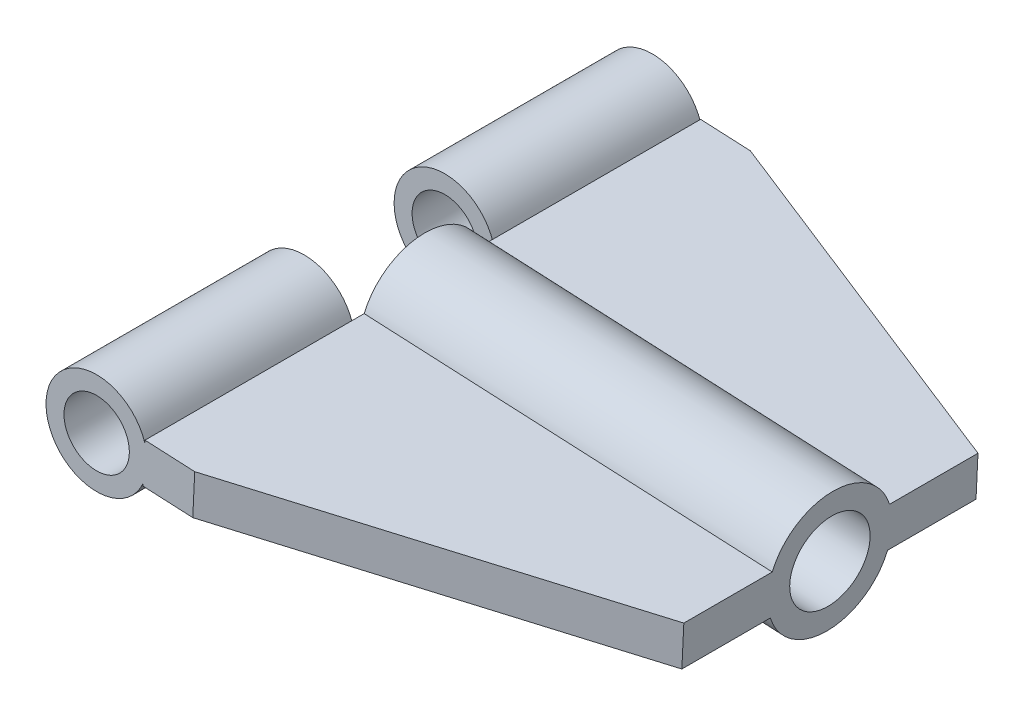
ISO-10303-21;
HEADER;
FILE_DESCRIPTION(('STEP AP214'),'2;1');
FILE_NAME('part.step','',(''),(''),'','','');
FILE_SCHEMA(('AUTOMOTIVE_DESIGN { 1 0 10303 214 1 1 1 1 }'));
ENDSEC;
DATA;
#1=APPLICATION_CONTEXT('core data for automotive mechanical design processes');
#2=APPLICATION_PROTOCOL_DEFINITION('international standard','automotive_design',2000,#1);
#3=PRODUCT_CONTEXT('',#1,'mechanical');
#4=PRODUCT('Part','Part','',(#3));
#5=PRODUCT_RELATED_PRODUCT_CATEGORY('part','',(#4));
#6=PRODUCT_DEFINITION_FORMATION('','',#4);
#7=PRODUCT_DEFINITION_CONTEXT('part definition',#1,'design');
#8=PRODUCT_DEFINITION('design','',#6,#7);
#9=PRODUCT_DEFINITION_SHAPE('','',#8);
#10=(LENGTH_UNIT() NAMED_UNIT(*) SI_UNIT(.MILLI.,.METRE.));
#11=(NAMED_UNIT(*) PLANE_ANGLE_UNIT() SI_UNIT($,.RADIAN.));
#12=(NAMED_UNIT(*) SI_UNIT($,.STERADIAN.) SOLID_ANGLE_UNIT());
#13=UNCERTAINTY_MEASURE_WITH_UNIT(LENGTH_MEASURE(1.E-05),#10,'distance_accuracy_value','');
#14=(GEOMETRIC_REPRESENTATION_CONTEXT(3) GLOBAL_UNCERTAINTY_ASSIGNED_CONTEXT((#13)) GLOBAL_UNIT_ASSIGNED_CONTEXT((#10,
#11,#12)) REPRESENTATION_CONTEXT('',''));
#15=CARTESIAN_POINT('',(0.,0.,0.));
#16=DIRECTION('',(0.,0.,1.));
#17=DIRECTION('',(1.,0.,0.));
#18=AXIS2_PLACEMENT_3D('',#15,#16,#17);
#19=CARTESIAN_POINT('',(31.5631273679821,-1.52610312644342,0.));
#20=DIRECTION('',(0.998833144556395,-0.0482944027355513,0.));
#21=DIRECTION('',(0.0482944027355513,0.998833144556395,0.));
#22=AXIS2_PLACEMENT_3D('',#19,#20,#21);
#23=CYLINDRICAL_SURFACE('',#22,3.8);
#24=DIRECTION('',(0.998833144556395,-0.0482944027355513,0.));
#25=VECTOR('',#24,1.);
#26=CARTESIAN_POINT('',(31.6234953714015,-0.277561695747925,-3.58852337319962));
#27=LINE('',#26,#25);
#28=CARTESIAN_POINT('',(2.95698412263299,1.1084876627624,-3.58852337319962));
#29=VERTEX_POINT('',#28);
#30=CARTESIAN_POINT('',(27.9278127365429,-0.098872405626385,-3.58852337319962));
#31=VERTEX_POINT('',#30);
#32=EDGE_CURVE('E191',#29,#31,#27,.T.);
#33=ORIENTED_EDGE('',*,*,#32,.F.);
#34=CARTESIAN_POINT('',(2.89661611921354,-0.140053767933099,0.));
#35=DIRECTION('',(0.998833144556395,-0.0482944027355513,0.));
#36=DIRECTION('',(0.0482944027355513,0.998833144556395,0.));
#37=AXIS2_PLACEMENT_3D('',#34,#35,#36);
#38=CIRCLE('',#37,3.8);
#39=CARTESIAN_POINT('',(2.95698412263299,1.1084876627624,3.58852337319962));
#40=VERTEX_POINT('',#39);
#41=EDGE_CURVE('E246',#29,#40,#38,.T.);
#42=ORIENTED_EDGE('',*,*,#41,.T.);
#43=DIRECTION('',(0.998833144556395,-0.0482944027355513,0.));
#44=VECTOR('',#43,1.);
#45=CARTESIAN_POINT('',(31.6234953714015,-0.277561695747925,3.58852337319962));
#46=LINE('',#45,#44);
#47=CARTESIAN_POINT('',(27.9278127365429,-0.0988724056263858,3.58852337319962));
#48=VERTEX_POINT('',#47);
#49=EDGE_CURVE('E182',#48,#40,#46,.F.);
#50=ORIENTED_EDGE('',*,*,#49,.F.);
#51=CARTESIAN_POINT('',(27.8674447331234,-1.34741383632188,0.));
#52=DIRECTION('',(-0.998833144556395,0.0482944027355513,0.));
#53=DIRECTION('',(-0.0482944027355513,-0.998833144556395,0.));
#54=AXIS2_PLACEMENT_3D('',#51,#52,#53);
#55=CIRCLE('',#54,3.8);
#56=EDGE_CURVE('E211',#48,#31,#55,.T.);
#57=ORIENTED_EDGE('',*,*,#56,.T.);
#58=EDGE_LOOP('',(#33,#42,#50,#57));
#59=FACE_BOUND('',#58,.T.);
#60=ADVANCED_FACE('F17',(#59),#23,.T.);
#61=CARTESIAN_POINT('',(0.,0.,17.));
#62=DIRECTION('',(0.,0.,-1.));
#63=DIRECTION('',(-1.,0.,0.));
#64=AXIS2_PLACEMENT_3D('',#61,#62,#63);
#65=CYLINDRICAL_SURFACE('',#64,3.1);
#66=DIRECTION('',(0.,0.,-1.));
#67=VECTOR('',#66,1.);
#68=CARTESIAN_POINT('',(2.84371225165455,-1.23422065684781,17.));
#69=LINE('',#68,#67);
#70=CARTESIAN_POINT('',(2.84371225165455,-1.23422065684781,-4.30000000000004));
#71=VERTEX_POINT('',#70);
#72=CARTESIAN_POINT('',(2.84371225165454,-1.23422065684781,-17.));
#73=VERTEX_POINT('',#72);
#74=EDGE_CURVE('E172',#71,#73,#69,.T.);
#75=ORIENTED_EDGE('',*,*,#74,.F.);
#76=CARTESIAN_POINT('',(0.,0.,-4.30000000000002));
#77=DIRECTION('',(0.,0.,-1.));
#78=DIRECTION('',(-1.,0.,0.));
#79=AXIS2_PLACEMENT_3D('',#76,#77,#78);
#80=CIRCLE('',#79,3.1);
#81=CARTESIAN_POINT('',(2.94951998677255,0.95411312098161,-4.30000000000004));
#82=VERTEX_POINT('',#81);
#83=EDGE_CURVE('E224',#71,#82,#80,.T.);
#84=ORIENTED_EDGE('',*,*,#83,.T.);
#85=DIRECTION('',(0.,0.,-1.));
#86=VECTOR('',#85,1.);
#87=CARTESIAN_POINT('',(2.94951998677255,0.954113120981612,17.));
#88=LINE('',#87,#86);
#89=CARTESIAN_POINT('',(2.94951998677255,0.954113120981614,-17.));
#90=VERTEX_POINT('',#89);
#91=EDGE_CURVE('E171',#90,#82,#88,.F.);
#92=ORIENTED_EDGE('',*,*,#91,.F.);
#93=CARTESIAN_POINT('',(0.,0.,-17.));
#94=DIRECTION('',(0.,0.,1.));
#95=DIRECTION('',(1.,0.,0.));
#96=AXIS2_PLACEMENT_3D('',#93,#94,#95);
#97=CIRCLE('',#96,3.1);
#98=EDGE_CURVE('E183',#90,#73,#97,.T.);
#99=ORIENTED_EDGE('',*,*,#98,.T.);
#100=EDGE_LOOP('',(#75,#84,#92,#99));
#101=FACE_BOUND('',#100,.T.);
#102=ADVANCED_FACE('F288',(#101),#65,.T.);
#103=CARTESIAN_POINT('',(0.,0.,17.));
#104=DIRECTION('',(0.,0.,-1.));
#105=DIRECTION('',(-1.,0.,0.));
#106=AXIS2_PLACEMENT_3D('',#103,#104,#105);
#107=CYLINDRICAL_SURFACE('',#106,2.);
#108=CARTESIAN_POINT('',(0.,0.,4.30000000000002));
#109=DIRECTION('',(0.,0.,1.));
#110=DIRECTION('',(1.,0.,0.));
#111=AXIS2_PLACEMENT_3D('',#108,#109,#110);
#112=CIRCLE('',#111,2.);
#113=CARTESIAN_POINT('',(2.,0.,4.30000000000003));
#114=VERTEX_POINT('',#113);
#115=EDGE_CURVE('E239',#114,#114,#112,.T.);
#116=ORIENTED_EDGE('',*,*,#115,.F.);
#117=EDGE_LOOP('',(#116));
#118=FACE_BOUND('',#117,.T.);
#119=CARTESIAN_POINT('',(0.,0.,17.));
#120=DIRECTION('',(0.,0.,1.));
#121=DIRECTION('',(1.,0.,0.));
#122=AXIS2_PLACEMENT_3D('',#119,#120,#121);
#123=CIRCLE('',#122,2.);
#124=CARTESIAN_POINT('',(2.,0.,17.));
#125=VERTEX_POINT('',#124);
#126=EDGE_CURVE('E178',#125,#125,#123,.T.);
#127=ORIENTED_EDGE('',*,*,#126,.T.);
#128=EDGE_LOOP('',(#127));
#129=FACE_BOUND('',#128,.T.);
#130=ADVANCED_FACE('F292',(#118,#129),#107,.F.);
#131=DIRECTION('',(0.998833144556395,-0.0482944027355513,0.));
#132=VECTOR('',#131,1.);
#133=CARTESIAN_POINT('',(31.5027593645626,-2.77464455713891,3.58852337319963));
#134=LINE('',#133,#132);
#135=CARTESIAN_POINT('',(2.83624811579411,-1.38859519862859,3.58852337319963));
#136=VERTEX_POINT('',#135);
#137=CARTESIAN_POINT('',(27.807076729704,-2.59595526701737,3.58852337319962));
#138=VERTEX_POINT('',#137);
#139=EDGE_CURVE('E188',#136,#138,#134,.T.);
#140=ORIENTED_EDGE('',*,*,#139,.F.);
#141=CARTESIAN_POINT('',(2.8362481157941,-1.38859519862859,-3.58852337319963));
#142=VERTEX_POINT('',#141);
#143=EDGE_CURVE('E210',#136,#142,#38,.T.);
#144=ORIENTED_EDGE('',*,*,#143,.T.);
#145=DIRECTION('',(0.998833144556395,-0.0482944027355513,0.));
#146=VECTOR('',#145,1.);
#147=CARTESIAN_POINT('',(31.5027593645626,-2.77464455713891,-3.58852337319963));
#148=LINE('',#147,#146);
#149=CARTESIAN_POINT('',(27.807076729704,-2.59595526701737,-3.58852337319963));
#150=VERTEX_POINT('',#149);
#151=EDGE_CURVE('E123',#150,#142,#148,.F.);
#152=ORIENTED_EDGE('',*,*,#151,.F.);
#153=EDGE_CURVE('E205',#150,#138,#55,.T.);
#154=ORIENTED_EDGE('',*,*,#153,.T.);
#155=EDGE_LOOP('',(#140,#144,#152,#154));
#156=FACE_BOUND('',#155,.T.);
#157=ADVANCED_FACE('F213',(#156),#23,.T.);
#158=CARTESIAN_POINT('',(2.84371225165454,-1.23422065684781,17.));
#159=VERTEX_POINT('',#158);
#160=CARTESIAN_POINT('',(2.84371225165454,-1.23422065684781,4.30000000000004));
#161=VERTEX_POINT('',#160);
#162=EDGE_CURVE('E175',#159,#161,#69,.T.);
#163=ORIENTED_EDGE('',*,*,#162,.F.);
#164=CARTESIAN_POINT('',(0.,0.,17.));
#165=DIRECTION('',(0.,0.,1.));
#166=DIRECTION('',(1.,0.,0.));
#167=AXIS2_PLACEMENT_3D('',#164,#165,#166);
#168=CIRCLE('',#167,3.1);
#169=CARTESIAN_POINT('',(2.94951998677255,0.954113120981614,17.));
#170=VERTEX_POINT('',#169);
#171=EDGE_CURVE('E176',#170,#159,#168,.T.);
#172=ORIENTED_EDGE('',*,*,#171,.F.);
#173=CARTESIAN_POINT('',(2.94951998677255,0.95411312098161,4.30000000000004));
#174=VERTEX_POINT('',#173);
#175=EDGE_CURVE('E169',#174,#170,#88,.F.);
#176=ORIENTED_EDGE('',*,*,#175,.F.);
#177=CARTESIAN_POINT('',(0.,0.,4.30000000000002));
#178=DIRECTION('',(0.,0.,1.));
#179=DIRECTION('',(1.,0.,0.));
#180=AXIS2_PLACEMENT_3D('',#177,#178,#179);
#181=CIRCLE('',#180,3.1);
#182=EDGE_CURVE('E242',#174,#161,#181,.T.);
#183=ORIENTED_EDGE('',*,*,#182,.T.);
#184=EDGE_LOOP('',(#163,#172,#176,#183));
#185=FACE_BOUND('',#184,.T.);
#186=ADVANCED_FACE('F267',(#185),#65,.T.);
#187=CARTESIAN_POINT('',(0.,0.,-4.30000000000002));
#188=DIRECTION('',(0.,0.,-1.));
#189=DIRECTION('',(-1.,0.,0.));
#190=AXIS2_PLACEMENT_3D('',#187,#188,#189);
#191=CIRCLE('',#190,2.);
#192=CARTESIAN_POINT('',(-2.,0.,-4.30000000000001));
#193=VERTEX_POINT('',#192);
#194=EDGE_CURVE('E250',#193,#193,#191,.T.);
#195=ORIENTED_EDGE('',*,*,#194,.F.);
#196=EDGE_LOOP('',(#195));
#197=FACE_BOUND('',#196,.T.);
#198=CARTESIAN_POINT('',(0.,0.,-17.));
#199=DIRECTION('',(0.,0.,1.));
#200=DIRECTION('',(1.,0.,0.));
#201=AXIS2_PLACEMENT_3D('',#198,#199,#200);
#202=CIRCLE('',#201,2.);
#203=CARTESIAN_POINT('',(2.,0.,-17.));
#204=VERTEX_POINT('',#203);
#205=EDGE_CURVE('E179',#204,#204,#202,.T.);
#206=ORIENTED_EDGE('',*,*,#205,.F.);
#207=EDGE_LOOP('',(#206));
#208=FACE_BOUND('',#207,.T.);
#209=ADVANCED_FACE('F299',(#197,#208),#107,.F.);
#210=CARTESIAN_POINT('',(0.,0.,17.));
#211=DIRECTION('',(0.,0.,1.));
#212=DIRECTION('',(1.,0.,0.));
#213=AXIS2_PLACEMENT_3D('',#210,#211,#212);
#214=PLANE('',#213);
#215=DIRECTION('',(-0.0482944027355513,-0.998833144556395,0.));
#216=VECTOR('',#215,1.);
#217=CARTESIAN_POINT('',(6.47229797391252,10.6999094826493,17.));
#218=LINE('',#217,#216);
#219=CARTESIAN_POINT('',(6.00142754724089,0.961286323224432,17.));
#220=VERTEX_POINT('',#219);
#221=CARTESIAN_POINT('',(5.88069154040201,-1.53579653816655,17.));
#222=VERTEX_POINT('',#221);
#223=EDGE_CURVE('E117',#220,#222,#218,.T.);
#224=ORIENTED_EDGE('',*,*,#223,.F.);
#225=DIRECTION('',(-0.998833144556395,0.0482944027355512,0.));
#226=VECTOR('',#225,1.);
#227=CARTESIAN_POINT('',(27.9278127365429,-0.0988724056263859,17.));
#228=LINE('',#227,#226);
#229=CARTESIAN_POINT('',(2.95698412263299,1.1084876627624,17.));
#230=VERTEX_POINT('',#229);
#231=EDGE_CURVE('E130',#220,#230,#228,.T.);
#232=ORIENTED_EDGE('',*,*,#231,.T.);
#233=DIRECTION('',(-0.0482944027355514,-0.998833144556395,0.));
#234=VECTOR('',#233,1.);
#235=CARTESIAN_POINT('',(2.95698412263298,1.1084876627624,17.));
#236=LINE('',#235,#234);
#237=EDGE_CURVE('E144',#230,#170,#236,.T.);
#238=ORIENTED_EDGE('',*,*,#237,.T.);
#239=ORIENTED_EDGE('',*,*,#171,.T.);
#240=CARTESIAN_POINT('',(2.83624811579411,-1.38859519862859,17.));
#241=VERTEX_POINT('',#240);
#242=EDGE_CURVE('E157',#159,#241,#236,.T.);
#243=ORIENTED_EDGE('',*,*,#242,.T.);
#244=DIRECTION('',(0.998833144556395,-0.0482944027355512,0.));
#245=VECTOR('',#244,1.);
#246=CARTESIAN_POINT('',(2.83624811579411,-1.38859519862859,17.));
#247=LINE('',#246,#245);
#248=EDGE_CURVE('E133',#241,#222,#247,.T.);
#249=ORIENTED_EDGE('',*,*,#248,.T.);
#250=EDGE_LOOP('',(#224,#232,#238,#239,#243,#249));
#251=FACE_BOUND('',#250,.T.);
#252=ORIENTED_EDGE('',*,*,#126,.F.);
#253=EDGE_LOOP('',(#252));
#254=FACE_BOUND('',#253,.T.);
#255=ADVANCED_FACE('F127',(#251,#254),#214,.T.);
#256=CARTESIAN_POINT('',(0.,0.,-17.));
#257=DIRECTION('',(0.,0.,1.));
#258=DIRECTION('',(1.,0.,0.));
#259=AXIS2_PLACEMENT_3D('',#256,#257,#258);
#260=PLANE('',#259);
#261=DIRECTION('',(-0.998833144556395,0.0482944027355512,0.));
#262=VECTOR('',#261,1.);
#263=CARTESIAN_POINT('',(27.9278127365429,-0.0988724056263859,-17.));
#264=LINE('',#263,#262);
#265=CARTESIAN_POINT('',(6.00142754724088,0.961286323224433,-17.));
#266=VERTEX_POINT('',#265);
#267=CARTESIAN_POINT('',(2.95698412263299,1.1084876627624,-17.));
#268=VERTEX_POINT('',#267);
#269=EDGE_CURVE('E155',#266,#268,#264,.T.);
#270=ORIENTED_EDGE('',*,*,#269,.F.);
#271=DIRECTION('',(-0.0482944027355513,-0.998833144556395,0.));
#272=VECTOR('',#271,1.);
#273=CARTESIAN_POINT('',(6.4722979739125,10.6999094826493,-17.));
#274=LINE('',#273,#272);
#275=CARTESIAN_POINT('',(5.880691540402,-1.53579653816655,-17.));
#276=VERTEX_POINT('',#275);
#277=EDGE_CURVE('E228',#266,#276,#274,.T.);
#278=ORIENTED_EDGE('',*,*,#277,.T.);
#279=DIRECTION('',(0.998833144556395,-0.0482944027355512,0.));
#280=VECTOR('',#279,1.);
#281=CARTESIAN_POINT('',(2.83624811579411,-1.38859519862859,-17.));
#282=LINE('',#281,#280);
#283=CARTESIAN_POINT('',(2.83624811579411,-1.38859519862859,-17.));
#284=VERTEX_POINT('',#283);
#285=EDGE_CURVE('E151',#284,#276,#282,.T.);
#286=ORIENTED_EDGE('',*,*,#285,.F.);
#287=DIRECTION('',(-0.0482944027355514,-0.998833144556395,0.));
#288=VECTOR('',#287,1.);
#289=CARTESIAN_POINT('',(2.95698412263298,1.1084876627624,-17.));
#290=LINE('',#289,#288);
#291=EDGE_CURVE('E152',#73,#284,#290,.T.);
#292=ORIENTED_EDGE('',*,*,#291,.F.);
#293=ORIENTED_EDGE('',*,*,#98,.F.);
#294=EDGE_CURVE('E148',#268,#90,#290,.T.);
#295=ORIENTED_EDGE('',*,*,#294,.F.);
#296=EDGE_LOOP('',(#270,#278,#286,#292,#293,#295));
#297=FACE_BOUND('',#296,.T.);
#298=ORIENTED_EDGE('',*,*,#205,.T.);
#299=EDGE_LOOP('',(#298));
#300=FACE_BOUND('',#299,.T.);
#301=ADVANCED_FACE('F226',(#297,#300),#260,.F.);
#302=CARTESIAN_POINT('',(27.9278127365429,-0.0988724056263859,17.));
#303=DIRECTION('',(-0.0482944027355513,-0.998833144556395,0.));
#304=DIRECTION('',(0.998833144556395,-0.0482944027355512,0.));
#305=AXIS2_PLACEMENT_3D('',#302,#303,#304);
#306=PLANE('',#305);
#307=DIRECTION('',(0.,0.,-1.));
#308=VECTOR('',#307,1.);
#309=CARTESIAN_POINT('',(27.9278127365429,-0.0988724056263861,17.));
#310=LINE('',#309,#308);
#311=CARTESIAN_POINT('',(27.9278127365429,-0.09887240562639,-9.));
#312=VERTEX_POINT('',#311);
#313=EDGE_CURVE('E159',#31,#312,#310,.T.);
#314=ORIENTED_EDGE('',*,*,#313,.T.);
#315=DIRECTION('',(-0.938456937147793,0.0453751635291559,-0.342402791539272));
#316=VECTOR('',#315,1.);
#317=CARTESIAN_POINT('',(36.2823998870316,-0.502823554758668,-5.95176853699897));
#318=LINE('',#317,#316);
#319=EDGE_CURVE('E248',#312,#266,#318,.T.);
#320=ORIENTED_EDGE('',*,*,#319,.T.);
#321=ORIENTED_EDGE('',*,*,#269,.T.);
#322=DIRECTION('',(0.,0.,-1.));
#323=VECTOR('',#322,1.);
#324=CARTESIAN_POINT('',(2.95698412263299,1.1084876627624,17.));
#325=LINE('',#324,#323);
#326=EDGE_CURVE('E141',#29,#268,#325,.T.);
#327=ORIENTED_EDGE('',*,*,#326,.F.);
#328=ORIENTED_EDGE('',*,*,#32,.T.);
#329=EDGE_LOOP('',(#314,#320,#321,#327,#328));
#330=FACE_BOUND('',#329,.T.);
#331=ADVANCED_FACE('F285',(#330),#306,.F.);
#332=CARTESIAN_POINT('',(2.83624811579411,-1.38859519862859,17.));
#333=DIRECTION('',(0.0482944027355512,0.998833144556395,0.));
#334=DIRECTION('',(-0.998833144556395,0.0482944027355512,0.));
#335=AXIS2_PLACEMENT_3D('',#332,#333,#334);
#336=PLANE('',#335);
#337=ORIENTED_EDGE('',*,*,#285,.T.);
#338=DIRECTION('',(0.938456937147793,-0.0453751635291559,0.342402791539272));
#339=VECTOR('',#338,1.);
#340=CARTESIAN_POINT('',(14.1184070139031,-1.93409684574679,-13.9944100124555));
#341=LINE('',#340,#339);
#342=CARTESIAN_POINT('',(27.807076729704,-2.59595526701737,-9.));
#343=VERTEX_POINT('',#342);
#344=EDGE_CURVE('E24',#276,#343,#341,.T.);
#345=ORIENTED_EDGE('',*,*,#344,.T.);
#346=DIRECTION('',(0.,0.,-1.));
#347=VECTOR('',#346,1.);
#348=CARTESIAN_POINT('',(27.807076729704,-2.59595526701737,17.));
#349=LINE('',#348,#347);
#350=EDGE_CURVE('E162',#150,#343,#349,.T.);
#351=ORIENTED_EDGE('',*,*,#350,.F.);
#352=ORIENTED_EDGE('',*,*,#151,.T.);
#353=DIRECTION('',(0.,0.,-1.));
#354=VECTOR('',#353,1.);
#355=CARTESIAN_POINT('',(2.83624811579411,-1.38859519862859,17.));
#356=LINE('',#355,#354);
#357=EDGE_CURVE('E166',#142,#284,#356,.T.);
#358=ORIENTED_EDGE('',*,*,#357,.T.);
#359=EDGE_LOOP('',(#337,#345,#351,#352,#358));
#360=FACE_BOUND('',#359,.T.);
#361=ADVANCED_FACE('F198',(#360),#336,.F.);
#362=CARTESIAN_POINT('',(27.807076729704,-2.59595526701738,9.00000000000001));
#363=VERTEX_POINT('',#362);
#364=EDGE_CURVE('E163',#363,#138,#349,.T.);
#365=ORIENTED_EDGE('',*,*,#364,.F.);
#366=DIRECTION('',(-0.938456937147793,0.0453751635291559,0.342402791539272));
#367=VECTOR('',#366,1.);
#368=CARTESIAN_POINT('',(3.19317766326397,-1.40585303534304,17.9805588486877));
#369=LINE('',#368,#367);
#370=EDGE_CURVE('E244',#363,#222,#369,.T.);
#371=ORIENTED_EDGE('',*,*,#370,.T.);
#372=ORIENTED_EDGE('',*,*,#248,.F.);
#373=EDGE_CURVE('E167',#241,#136,#356,.T.);
#374=ORIENTED_EDGE('',*,*,#373,.T.);
#375=ORIENTED_EDGE('',*,*,#139,.T.);
#376=EDGE_LOOP('',(#365,#371,#372,#374,#375));
#377=FACE_BOUND('',#376,.T.);
#378=ADVANCED_FACE('F258',(#377),#336,.F.);
#379=CARTESIAN_POINT('',(27.807076729704,-2.59595526701737,17.));
#380=DIRECTION('',(-0.998833144556395,0.0482944027355492,0.));
#381=DIRECTION('',(-0.0482944027355492,-0.998833144556395,0.));
#382=AXIS2_PLACEMENT_3D('',#379,#380,#381);
#383=PLANE('',#382);
#384=CARTESIAN_POINT('',(27.8674447331234,-1.34741383632188,0.));
#385=DIRECTION('',(0.998833144556395,-0.0482944027355512,0.));
#386=DIRECTION('',(0.0482944027355512,0.998833144556395,0.));
#387=AXIS2_PLACEMENT_3D('',#384,#385,#386);
#388=CIRCLE('',#387,2.4585);
#389=CARTESIAN_POINT('',(27.9861765222488,1.10821744957002,0.));
#390=VERTEX_POINT('',#389);
#391=EDGE_CURVE('E134',#390,#390,#388,.T.);
#392=ORIENTED_EDGE('',*,*,#391,.F.);
#393=EDGE_LOOP('',(#392));
#394=FACE_BOUND('',#393,.T.);
#395=CARTESIAN_POINT('',(27.9278127365429,-0.0988724056263859,9.00000000000001));
#396=VERTEX_POINT('',#395);
#397=EDGE_CURVE('E160',#396,#48,#310,.T.);
#398=ORIENTED_EDGE('',*,*,#397,.F.);
#399=DIRECTION('',(-0.0482944027355513,-0.998833144556395,0.));
#400=VECTOR('',#399,1.);
#401=CARTESIAN_POINT('',(28.3986831632145,9.63975075379846,9.00000000000001));
#402=LINE('',#401,#400);
#403=EDGE_CURVE('E39',#396,#363,#402,.T.);
#404=ORIENTED_EDGE('',*,*,#403,.T.);
#405=ORIENTED_EDGE('',*,*,#364,.T.);
#406=ORIENTED_EDGE('',*,*,#153,.F.);
#407=ORIENTED_EDGE('',*,*,#350,.T.);
#408=DIRECTION('',(-0.0482944027355513,-0.998833144556395,0.));
#409=VECTOR('',#408,1.);
#410=CARTESIAN_POINT('',(28.3986831632145,9.63975075379846,-9.));
#411=LINE('',#410,#409);
#412=EDGE_CURVE('E31',#312,#343,#411,.T.);
#413=ORIENTED_EDGE('',*,*,#412,.F.);
#414=ORIENTED_EDGE('',*,*,#313,.F.);
#415=ORIENTED_EDGE('',*,*,#56,.F.);
#416=EDGE_LOOP('',(#398,#404,#405,#406,#407,#413,#414,#415));
#417=FACE_BOUND('',#416,.T.);
#418=ADVANCED_FACE('F202',(#394,#417),#383,.F.);
#419=ORIENTED_EDGE('',*,*,#231,.F.);
#420=DIRECTION('',(0.938456937147793,-0.0453751635291559,-0.342402791539272));
#421=VECTOR('',#420,1.);
#422=CARTESIAN_POINT('',(25.3571705363925,0.0254202556450855,9.93791737323109));
#423=LINE('',#422,#421);
#424=EDGE_CURVE('E114',#220,#396,#423,.T.);
#425=ORIENTED_EDGE('',*,*,#424,.T.);
#426=ORIENTED_EDGE('',*,*,#397,.T.);
#427=ORIENTED_EDGE('',*,*,#49,.T.);
#428=EDGE_CURVE('E139',#230,#40,#325,.T.);
#429=ORIENTED_EDGE('',*,*,#428,.F.);
#430=EDGE_LOOP('',(#419,#425,#426,#427,#429));
#431=FACE_BOUND('',#430,.T.);
#432=ADVANCED_FACE('F136',(#431),#306,.F.);
#433=CARTESIAN_POINT('',(2.95698412263298,1.1084876627624,17.));
#434=DIRECTION('',(0.998833144556395,-0.0482944027355515,0.));
#435=DIRECTION('',(0.0482944027355514,0.998833144556395,0.));
#436=AXIS2_PLACEMENT_3D('',#433,#434,#435);
#437=PLANE('',#436);
#438=CARTESIAN_POINT('',(2.89661611921355,-0.140053767933101,0.));
#439=DIRECTION('',(0.998833144556395,-0.0482944027355515,0.));
#440=DIRECTION('',(0.0482944027355514,0.998833144556395,0.));
#441=AXIS2_PLACEMENT_3D('',#438,#439,#440);
#442=CIRCLE('',#441,2.4585);
#443=CARTESIAN_POINT('',(3.0153479083389,2.3155775179588,0.));
#444=VERTEX_POINT('',#443);
#445=EDGE_CURVE('E11',#444,#444,#442,.F.);
#446=ORIENTED_EDGE('',*,*,#445,.F.);
#447=EDGE_LOOP('',(#446));
#448=FACE_BOUND('',#447,.T.);
#449=ORIENTED_EDGE('',*,*,#143,.F.);
#450=ORIENTED_EDGE('',*,*,#373,.F.);
#451=ORIENTED_EDGE('',*,*,#242,.F.);
#452=ORIENTED_EDGE('',*,*,#162,.T.);
#453=DIRECTION('',(-0.0482944027355513,-0.998833144556395,0.));
#454=VECTOR('',#453,1.);
#455=CARTESIAN_POINT('',(3.42785454930461,10.8471108221872,4.30000000000004));
#456=LINE('',#455,#454);
#457=EDGE_CURVE('E233',#174,#161,#456,.T.);
#458=ORIENTED_EDGE('',*,*,#457,.F.);
#459=ORIENTED_EDGE('',*,*,#175,.T.);
#460=ORIENTED_EDGE('',*,*,#237,.F.);
#461=ORIENTED_EDGE('',*,*,#428,.T.);
#462=ORIENTED_EDGE('',*,*,#41,.F.);
#463=ORIENTED_EDGE('',*,*,#326,.T.);
#464=ORIENTED_EDGE('',*,*,#294,.T.);
#465=ORIENTED_EDGE('',*,*,#91,.T.);
#466=DIRECTION('',(-0.0482944027355513,-0.998833144556395,0.));
#467=VECTOR('',#466,1.);
#468=CARTESIAN_POINT('',(3.42785454930461,10.8471108221872,-4.30000000000004));
#469=LINE('',#468,#467);
#470=EDGE_CURVE('E231',#82,#71,#469,.T.);
#471=ORIENTED_EDGE('',*,*,#470,.T.);
#472=ORIENTED_EDGE('',*,*,#74,.T.);
#473=ORIENTED_EDGE('',*,*,#291,.T.);
#474=ORIENTED_EDGE('',*,*,#357,.F.);
#475=EDGE_LOOP('',(#449,#450,#451,#452,#458,#459,#460,#461,#462,#463,#464,#465,#471,#472,#473,#474));
#476=FACE_BOUND('',#475,.T.);
#477=ADVANCED_FACE('F218',(#448,#476),#437,.F.);
#478=CARTESIAN_POINT('',(6.47229797391252,10.6999094826493,17.));
#479=DIRECTION('',(-0.342003256978059,0.0165361383123746,-0.939553259983762));
#480=DIRECTION('',(-0.939681743874086,0.,0.342050025916906));
#481=AXIS2_PLACEMENT_3D('',#478,#479,#480);
#482=PLANE('',#481);
#483=ORIENTED_EDGE('',*,*,#403,.F.);
#484=ORIENTED_EDGE('',*,*,#424,.F.);
#485=ORIENTED_EDGE('',*,*,#223,.T.);
#486=ORIENTED_EDGE('',*,*,#370,.F.);
#487=EDGE_LOOP('',(#483,#484,#485,#486));
#488=FACE_BOUND('',#487,.T.);
#489=ADVANCED_FACE('F116',(#488),#482,.F.);
#490=CARTESIAN_POINT('',(28.3986831632145,9.63975075379846,-9.));
#491=DIRECTION('',(-0.342003256978059,0.0165361383123746,0.939553259983762));
#492=DIRECTION('',(0.939681743874086,0.,0.342050025916906));
#493=AXIS2_PLACEMENT_3D('',#490,#491,#492);
#494=PLANE('',#493);
#495=ORIENTED_EDGE('',*,*,#412,.T.);
#496=ORIENTED_EDGE('',*,*,#344,.F.);
#497=ORIENTED_EDGE('',*,*,#277,.F.);
#498=ORIENTED_EDGE('',*,*,#319,.F.);
#499=EDGE_LOOP('',(#495,#496,#497,#498));
#500=FACE_BOUND('',#499,.T.);
#501=ADVANCED_FACE('F327',(#500),#494,.F.);
#502=CARTESIAN_POINT('',(3.42785454930461,10.8471108221872,4.30000000000004));
#503=DIRECTION('',(0.,0.,1.));
#504=DIRECTION('',(1.,0.,0.));
#505=AXIS2_PLACEMENT_3D('',#502,#503,#504);
#506=PLANE('',#505);
#507=ORIENTED_EDGE('',*,*,#115,.T.);
#508=EDGE_LOOP('',(#507));
#509=FACE_BOUND('',#508,.T.);
#510=ORIENTED_EDGE('',*,*,#457,.T.);
#511=ORIENTED_EDGE('',*,*,#182,.F.);
#512=EDGE_LOOP('',(#510,#511));
#513=FACE_BOUND('',#512,.T.);
#514=ADVANCED_FACE('F269',(#509,#513),#506,.F.);
#515=CARTESIAN_POINT('',(-2.56514431803375,11.1368772386006,-4.3));
#516=DIRECTION('',(0.,0.,-1.));
#517=DIRECTION('',(-1.,0.,0.));
#518=AXIS2_PLACEMENT_3D('',#515,#516,#517);
#519=PLANE('',#518);
#520=ORIENTED_EDGE('',*,*,#194,.T.);
#521=EDGE_LOOP('',(#520));
#522=FACE_BOUND('',#521,.T.);
#523=ORIENTED_EDGE('',*,*,#83,.F.);
#524=ORIENTED_EDGE('',*,*,#470,.F.);
#525=EDGE_LOOP('',(#523,#524));
#526=FACE_BOUND('',#525,.T.);
#527=ADVANCED_FACE('F331',(#522,#526),#519,.F.);
#528=CARTESIAN_POINT('',(27.8674447331234,-1.34741383632188,0.));
#529=DIRECTION('',(0.998833144556395,-0.0482944027355512,0.));
#530=DIRECTION('',(0.0482944027355512,0.998833144556395,0.));
#531=AXIS2_PLACEMENT_3D('',#528,#529,#530);
#532=CYLINDRICAL_SURFACE('',#531,2.4585);
#533=ORIENTED_EDGE('',*,*,#391,.T.);
#534=EDGE_LOOP('',(#533));
#535=FACE_BOUND('',#534,.T.);
#536=ORIENTED_EDGE('',*,*,#445,.T.);
#537=EDGE_LOOP('',(#536));
#538=FACE_BOUND('',#537,.T.);
#539=ADVANCED_FACE('F274',(#535,#538),#532,.F.);
#540=CLOSED_SHELL('',(#60,#102,#130,#157,#186,#209,#255,#301,#331,#361,#378,#418,#432,#477,#489,
#501,#514,#527,#539));
#541=MANIFOLD_SOLID_BREP('B1',#540);
#542=ADVANCED_BREP_SHAPE_REPRESENTATION('',(#18,#541),#14);
#543=SHAPE_DEFINITION_REPRESENTATION(#9,#542);
ENDSEC;
END-ISO-10303-21;
